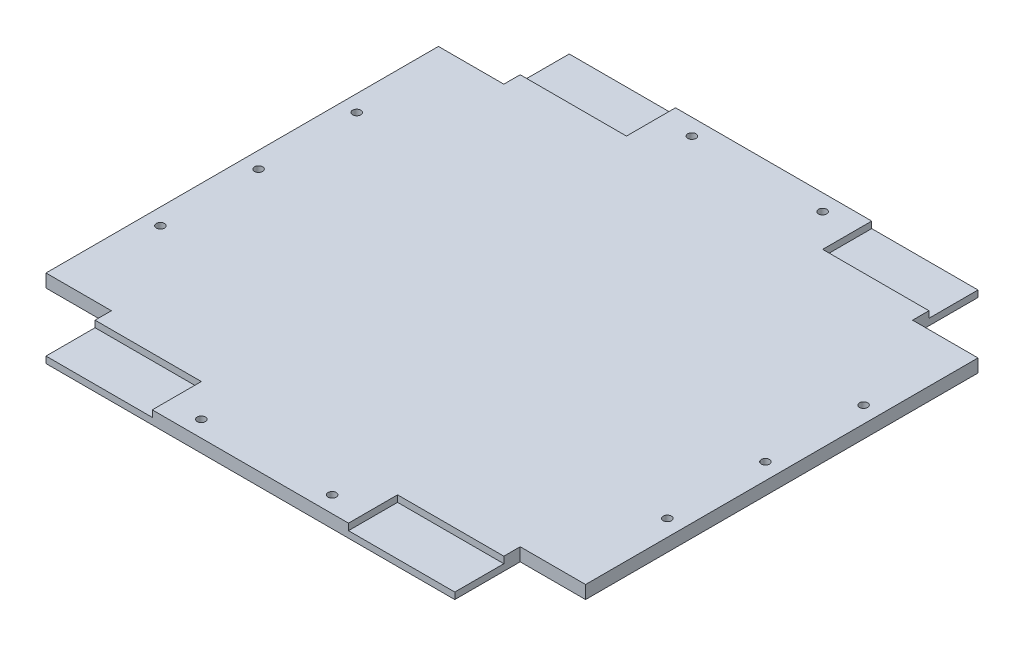
ISO-10303-21;
HEADER;
FILE_DESCRIPTION(('STEP AP214'),'2;1');
FILE_NAME('part.step','',(''),(''),'','','');
FILE_SCHEMA(('AUTOMOTIVE_DESIGN { 1 0 10303 214 1 1 1 1 }'));
ENDSEC;
DATA;
#1=APPLICATION_CONTEXT('core data for automotive mechanical design processes');
#2=APPLICATION_PROTOCOL_DEFINITION('international standard','automotive_design',2000,#1);
#3=PRODUCT_CONTEXT('',#1,'mechanical');
#4=PRODUCT('Part','Part','',(#3));
#5=PRODUCT_RELATED_PRODUCT_CATEGORY('part','',(#4));
#6=PRODUCT_DEFINITION_FORMATION('','',#4);
#7=PRODUCT_DEFINITION_CONTEXT('part definition',#1,'design');
#8=PRODUCT_DEFINITION('design','',#6,#7);
#9=PRODUCT_DEFINITION_SHAPE('','',#8);
#10=(LENGTH_UNIT() NAMED_UNIT(*) SI_UNIT(.MILLI.,.METRE.));
#11=(NAMED_UNIT(*) PLANE_ANGLE_UNIT() SI_UNIT($,.RADIAN.));
#12=(NAMED_UNIT(*) SI_UNIT($,.STERADIAN.) SOLID_ANGLE_UNIT());
#13=UNCERTAINTY_MEASURE_WITH_UNIT(LENGTH_MEASURE(1.E-05),#10,'distance_accuracy_value','');
#14=(GEOMETRIC_REPRESENTATION_CONTEXT(3) GLOBAL_UNCERTAINTY_ASSIGNED_CONTEXT((#13)) GLOBAL_UNIT_ASSIGNED_CONTEXT((#10,
#11,#12)) REPRESENTATION_CONTEXT('',''));
#15=CARTESIAN_POINT('',(0.,0.,0.));
#16=DIRECTION('',(0.,0.,1.));
#17=DIRECTION('',(1.,0.,0.));
#18=AXIS2_PLACEMENT_3D('',#15,#16,#17);
#19=CARTESIAN_POINT('',(0.,8.,0.));
#20=DIRECTION('',(0.,-1.,0.));
#21=DIRECTION('',(0.,0.,-1.));
#22=AXIS2_PLACEMENT_3D('',#19,#20,#21);
#23=PLANE('',#22);
#24=CARTESIAN_POINT('',(-40.,8.,-150.));
#25=DIRECTION('',(0.,1.,0.));
#26=DIRECTION('',(0.,0.,-1.));
#27=AXIS2_PLACEMENT_3D('',#24,#25,#26);
#28=CIRCLE('',#27,2.5);
#29=CARTESIAN_POINT('',(-40.,8.,-152.5));
#30=VERTEX_POINT('',#29);
#31=EDGE_CURVE('E298',#30,#30,#28,.T.);
#32=ORIENTED_EDGE('',*,*,#31,.F.);
#33=EDGE_LOOP('',(#32));
#34=FACE_BOUND('',#33,.T.);
#35=CARTESIAN_POINT('',(-40.,8.,150.));
#36=DIRECTION('',(0.,1.,0.));
#37=DIRECTION('',(0.,0.,1.));
#38=AXIS2_PLACEMENT_3D('',#35,#36,#37);
#39=CIRCLE('',#38,2.5);
#40=CARTESIAN_POINT('',(-40.,8.,152.5));
#41=VERTEX_POINT('',#40);
#42=EDGE_CURVE('E313',#41,#41,#39,.T.);
#43=ORIENTED_EDGE('',*,*,#42,.F.);
#44=EDGE_LOOP('',(#43));
#45=FACE_BOUND('',#44,.T.);
#46=CARTESIAN_POINT('',(-155.,8.,-60.0000000000001));
#47=DIRECTION('',(0.,1.,0.));
#48=DIRECTION('',(0.,0.,-1.));
#49=AXIS2_PLACEMENT_3D('',#46,#47,#48);
#50=CIRCLE('',#49,2.5);
#51=CARTESIAN_POINT('',(-155.,8.,-62.5000000000001));
#52=VERTEX_POINT('',#51);
#53=EDGE_CURVE('E307',#52,#52,#50,.T.);
#54=ORIENTED_EDGE('',*,*,#53,.F.);
#55=EDGE_LOOP('',(#54));
#56=FACE_BOUND('',#55,.T.);
#57=CARTESIAN_POINT('',(-155.,8.,0.));
#58=DIRECTION('',(0.,1.,0.));
#59=DIRECTION('',(0.,0.,-1.));
#60=AXIS2_PLACEMENT_3D('',#57,#58,#59);
#61=CIRCLE('',#60,2.5);
#62=CARTESIAN_POINT('',(-155.,8.,-2.50000000000006));
#63=VERTEX_POINT('',#62);
#64=EDGE_CURVE('E299',#63,#63,#61,.T.);
#65=ORIENTED_EDGE('',*,*,#64,.F.);
#66=EDGE_LOOP('',(#65));
#67=FACE_BOUND('',#66,.T.);
#68=CARTESIAN_POINT('',(-155.,8.,59.9999999999999));
#69=DIRECTION('',(0.,1.,0.));
#70=DIRECTION('',(0.,0.,-1.));
#71=AXIS2_PLACEMENT_3D('',#68,#69,#70);
#72=CIRCLE('',#71,2.5);
#73=CARTESIAN_POINT('',(-155.,8.,57.4999999999999));
#74=VERTEX_POINT('',#73);
#75=EDGE_CURVE('E306',#74,#74,#72,.T.);
#76=ORIENTED_EDGE('',*,*,#75,.F.);
#77=EDGE_LOOP('',(#76));
#78=FACE_BOUND('',#77,.T.);
#79=CARTESIAN_POINT('',(40.,8.,150.));
#80=DIRECTION('',(0.,1.,0.));
#81=DIRECTION('',(0.,0.,1.));
#82=AXIS2_PLACEMENT_3D('',#79,#80,#81);
#83=CIRCLE('',#82,2.5);
#84=CARTESIAN_POINT('',(40.,8.,152.5));
#85=VERTEX_POINT('',#84);
#86=EDGE_CURVE('E337',#85,#85,#83,.T.);
#87=ORIENTED_EDGE('',*,*,#86,.F.);
#88=EDGE_LOOP('',(#87));
#89=FACE_BOUND('',#88,.T.);
#90=CARTESIAN_POINT('',(155.,8.,59.9999999999999));
#91=DIRECTION('',(0.,1.,0.));
#92=DIRECTION('',(0.,0.,1.));
#93=AXIS2_PLACEMENT_3D('',#90,#91,#92);
#94=CIRCLE('',#93,2.5);
#95=CARTESIAN_POINT('',(155.,8.,62.4999999999999));
#96=VERTEX_POINT('',#95);
#97=EDGE_CURVE('E331',#96,#96,#94,.T.);
#98=ORIENTED_EDGE('',*,*,#97,.F.);
#99=EDGE_LOOP('',(#98));
#100=FACE_BOUND('',#99,.T.);
#101=CARTESIAN_POINT('',(155.,8.,0.));
#102=DIRECTION('',(0.,1.,0.));
#103=DIRECTION('',(0.,0.,1.));
#104=AXIS2_PLACEMENT_3D('',#101,#102,#103);
#105=CIRCLE('',#104,2.5);
#106=CARTESIAN_POINT('',(155.,8.,2.49999999999993));
#107=VERTEX_POINT('',#106);
#108=EDGE_CURVE('E323',#107,#107,#105,.T.);
#109=ORIENTED_EDGE('',*,*,#108,.F.);
#110=EDGE_LOOP('',(#109));
#111=FACE_BOUND('',#110,.T.);
#112=CARTESIAN_POINT('',(40.,8.,-150.));
#113=DIRECTION('',(0.,1.,0.));
#114=DIRECTION('',(0.,0.,-1.));
#115=AXIS2_PLACEMENT_3D('',#112,#113,#114);
#116=CIRCLE('',#115,2.5);
#117=CARTESIAN_POINT('',(40.,8.,-152.5));
#118=VERTEX_POINT('',#117);
#119=EDGE_CURVE('E288',#118,#118,#116,.T.);
#120=ORIENTED_EDGE('',*,*,#119,.F.);
#121=EDGE_LOOP('',(#120));
#122=FACE_BOUND('',#121,.T.);
#123=CARTESIAN_POINT('',(155.,8.,-60.0000000000001));
#124=DIRECTION('',(0.,1.,0.));
#125=DIRECTION('',(0.,0.,1.));
#126=AXIS2_PLACEMENT_3D('',#123,#124,#125);
#127=CIRCLE('',#126,2.5);
#128=CARTESIAN_POINT('',(155.,8.,-57.5000000000001));
#129=VERTEX_POINT('',#128);
#130=EDGE_CURVE('E330',#129,#129,#127,.T.);
#131=ORIENTED_EDGE('',*,*,#130,.F.);
#132=EDGE_LOOP('',(#131));
#133=FACE_BOUND('',#132,.T.);
#134=DIRECTION('',(0.,0.,-1.));
#135=VECTOR('',#134,1.);
#136=CARTESIAN_POINT('',(59.9999999999999,8.,-160.));
#137=LINE('',#136,#135);
#138=CARTESIAN_POINT('',(59.9999999999999,8.,-130.));
#139=VERTEX_POINT('',#138);
#140=CARTESIAN_POINT('',(59.9999999999999,8.,-160.));
#141=VERTEX_POINT('',#140);
#142=EDGE_CURVE('E209',#139,#141,#137,.T.);
#143=ORIENTED_EDGE('',*,*,#142,.T.);
#144=DIRECTION('',(-1.,0.,0.));
#145=VECTOR('',#144,1.);
#146=CARTESIAN_POINT('',(125.,8.,-160.));
#147=LINE('',#146,#145);
#148=CARTESIAN_POINT('',(-60.,8.,-160.));
#149=VERTEX_POINT('',#148);
#150=EDGE_CURVE('E379',#141,#149,#147,.T.);
#151=ORIENTED_EDGE('',*,*,#150,.T.);
#152=DIRECTION('',(0.,0.,-1.));
#153=VECTOR('',#152,1.);
#154=CARTESIAN_POINT('',(-60.,8.,-160.));
#155=LINE('',#154,#153);
#156=CARTESIAN_POINT('',(-60.,8.,-130.));
#157=VERTEX_POINT('',#156);
#158=EDGE_CURVE('E264',#157,#149,#155,.T.);
#159=ORIENTED_EDGE('',*,*,#158,.F.);
#160=DIRECTION('',(1.,0.,0.));
#161=VECTOR('',#160,1.);
#162=CARTESIAN_POINT('',(-60.,8.,-130.));
#163=LINE('',#162,#161);
#164=CARTESIAN_POINT('',(-125.,8.,-130.));
#165=VERTEX_POINT('',#164);
#166=EDGE_CURVE('E274',#165,#157,#163,.T.);
#167=ORIENTED_EDGE('',*,*,#166,.F.);
#168=DIRECTION('',(0.,0.,1.));
#169=VECTOR('',#168,1.);
#170=CARTESIAN_POINT('',(-125.,8.,-160.));
#171=LINE('',#170,#169);
#172=CARTESIAN_POINT('',(-125.,8.,-120.));
#173=VERTEX_POINT('',#172);
#174=EDGE_CURVE('E353',#165,#173,#171,.T.);
#175=ORIENTED_EDGE('',*,*,#174,.T.);
#176=DIRECTION('',(-1.,0.,0.));
#177=VECTOR('',#176,1.);
#178=CARTESIAN_POINT('',(-125.,8.,-120.));
#179=LINE('',#178,#177);
#180=CARTESIAN_POINT('',(-165.,8.,-120.));
#181=VERTEX_POINT('',#180);
#182=EDGE_CURVE('E355',#173,#181,#179,.T.);
#183=ORIENTED_EDGE('',*,*,#182,.T.);
#184=DIRECTION('',(0.,0.,1.));
#185=VECTOR('',#184,1.);
#186=CARTESIAN_POINT('',(-165.,8.,-120.));
#187=LINE('',#186,#185);
#188=CARTESIAN_POINT('',(-165.,8.,120.));
#189=VERTEX_POINT('',#188);
#190=EDGE_CURVE('E358',#181,#189,#187,.T.);
#191=ORIENTED_EDGE('',*,*,#190,.T.);
#192=DIRECTION('',(1.,0.,0.));
#193=VECTOR('',#192,1.);
#194=CARTESIAN_POINT('',(-125.,8.,120.));
#195=LINE('',#194,#193);
#196=CARTESIAN_POINT('',(-125.,8.,120.));
#197=VERTEX_POINT('',#196);
#198=EDGE_CURVE('E360',#189,#197,#195,.T.);
#199=ORIENTED_EDGE('',*,*,#198,.T.);
#200=DIRECTION('',(0.,0.,1.));
#201=VECTOR('',#200,1.);
#202=CARTESIAN_POINT('',(-125.,8.,160.));
#203=LINE('',#202,#201);
#204=CARTESIAN_POINT('',(-125.,8.,130.));
#205=VERTEX_POINT('',#204);
#206=EDGE_CURVE('E362',#197,#205,#203,.T.);
#207=ORIENTED_EDGE('',*,*,#206,.T.);
#208=DIRECTION('',(1.,0.,0.));
#209=VECTOR('',#208,1.);
#210=CARTESIAN_POINT('',(-60.,8.,130.));
#211=LINE('',#210,#209);
#212=CARTESIAN_POINT('',(-60.,8.,130.));
#213=VERTEX_POINT('',#212);
#214=EDGE_CURVE('E249',#205,#213,#211,.T.);
#215=ORIENTED_EDGE('',*,*,#214,.T.);
#216=DIRECTION('',(0.,0.,1.));
#217=VECTOR('',#216,1.);
#218=CARTESIAN_POINT('',(-60.,8.,160.));
#219=LINE('',#218,#217);
#220=CARTESIAN_POINT('',(-60.,8.,160.));
#221=VERTEX_POINT('',#220);
#222=EDGE_CURVE('E240',#213,#221,#219,.T.);
#223=ORIENTED_EDGE('',*,*,#222,.T.);
#224=DIRECTION('',(1.,0.,0.));
#225=VECTOR('',#224,1.);
#226=CARTESIAN_POINT('',(125.,8.,160.));
#227=LINE('',#226,#225);
#228=CARTESIAN_POINT('',(60.0000000000001,8.,160.));
#229=VERTEX_POINT('',#228);
#230=EDGE_CURVE('E365',#221,#229,#227,.T.);
#231=ORIENTED_EDGE('',*,*,#230,.T.);
#232=DIRECTION('',(0.,0.,1.));
#233=VECTOR('',#232,1.);
#234=CARTESIAN_POINT('',(60.0000000000001,8.,160.));
#235=LINE('',#234,#233);
#236=CARTESIAN_POINT('',(60.,8.,130.));
#237=VERTEX_POINT('',#236);
#238=EDGE_CURVE('E223',#237,#229,#235,.T.);
#239=ORIENTED_EDGE('',*,*,#238,.F.);
#240=DIRECTION('',(-1.,0.,0.));
#241=VECTOR('',#240,1.);
#242=CARTESIAN_POINT('',(60.,8.,130.));
#243=LINE('',#242,#241);
#244=CARTESIAN_POINT('',(125.,8.,130.));
#245=VERTEX_POINT('',#244);
#246=EDGE_CURVE('E227',#245,#237,#243,.T.);
#247=ORIENTED_EDGE('',*,*,#246,.F.);
#248=DIRECTION('',(0.,0.,-1.));
#249=VECTOR('',#248,1.);
#250=CARTESIAN_POINT('',(125.,8.,160.));
#251=LINE('',#250,#249);
#252=CARTESIAN_POINT('',(125.,8.,120.));
#253=VERTEX_POINT('',#252);
#254=EDGE_CURVE('E368',#245,#253,#251,.T.);
#255=ORIENTED_EDGE('',*,*,#254,.T.);
#256=DIRECTION('',(1.,0.,0.));
#257=VECTOR('',#256,1.);
#258=CARTESIAN_POINT('',(125.,8.,120.));
#259=LINE('',#258,#257);
#260=CARTESIAN_POINT('',(165.,8.,120.));
#261=VERTEX_POINT('',#260);
#262=EDGE_CURVE('E370',#253,#261,#259,.T.);
#263=ORIENTED_EDGE('',*,*,#262,.T.);
#264=DIRECTION('',(0.,0.,-1.));
#265=VECTOR('',#264,1.);
#266=CARTESIAN_POINT('',(165.,8.,-120.));
#267=LINE('',#266,#265);
#268=CARTESIAN_POINT('',(165.,8.,-120.));
#269=VERTEX_POINT('',#268);
#270=EDGE_CURVE('E372',#261,#269,#267,.T.);
#271=ORIENTED_EDGE('',*,*,#270,.T.);
#272=DIRECTION('',(-1.,0.,0.));
#273=VECTOR('',#272,1.);
#274=CARTESIAN_POINT('',(125.,8.,-120.));
#275=LINE('',#274,#273);
#276=CARTESIAN_POINT('',(125.,8.,-120.));
#277=VERTEX_POINT('',#276);
#278=EDGE_CURVE('E374',#269,#277,#275,.T.);
#279=ORIENTED_EDGE('',*,*,#278,.T.);
#280=DIRECTION('',(0.,0.,-1.));
#281=VECTOR('',#280,1.);
#282=CARTESIAN_POINT('',(125.,8.,-160.));
#283=LINE('',#282,#281);
#284=CARTESIAN_POINT('',(125.,8.,-130.));
#285=VERTEX_POINT('',#284);
#286=EDGE_CURVE('E376',#277,#285,#283,.T.);
#287=ORIENTED_EDGE('',*,*,#286,.T.);
#288=DIRECTION('',(-1.,0.,0.));
#289=VECTOR('',#288,1.);
#290=CARTESIAN_POINT('',(59.9999999999999,8.,-130.));
#291=LINE('',#290,#289);
#292=EDGE_CURVE('E214',#285,#139,#291,.T.);
#293=ORIENTED_EDGE('',*,*,#292,.T.);
#294=EDGE_LOOP('',(#143,#151,#159,#167,#175,#183,#191,#199,#207,#215,#223,#231,#239,#247,#255,
#263,#271,#279,#287,#293));
#295=FACE_BOUND('',#294,.T.);
#296=ADVANCED_FACE('F33',(#34,#45,#56,#67,#78,#89,#100,#111,#122,#133,#295),#23,.F.);
#297=CARTESIAN_POINT('',(125.,8.,-160.));
#298=DIRECTION('',(-1.,0.,0.));
#299=DIRECTION('',(0.,0.,1.));
#300=AXIS2_PLACEMENT_3D('',#297,#298,#299);
#301=PLANE('',#300);
#302=DIRECTION('',(0.,1.,0.));
#303=VECTOR('',#302,1.);
#304=CARTESIAN_POINT('',(125.,4.,-130.));
#305=LINE('',#304,#303);
#306=CARTESIAN_POINT('',(125.,4.,-130.));
#307=VERTEX_POINT('',#306);
#308=EDGE_CURVE('E200',#307,#285,#305,.T.);
#309=ORIENTED_EDGE('',*,*,#308,.T.);
#310=ORIENTED_EDGE('',*,*,#286,.F.);
#311=DIRECTION('',(0.,-1.,0.));
#312=VECTOR('',#311,1.);
#313=CARTESIAN_POINT('',(125.,8.,-120.));
#314=LINE('',#313,#312);
#315=CARTESIAN_POINT('',(125.,0.,-120.));
#316=VERTEX_POINT('',#315);
#317=EDGE_CURVE('E412',#277,#316,#314,.T.);
#318=ORIENTED_EDGE('',*,*,#317,.T.);
#319=DIRECTION('',(0.,0.,-1.));
#320=VECTOR('',#319,1.);
#321=CARTESIAN_POINT('',(125.,0.,-160.));
#322=LINE('',#321,#320);
#323=CARTESIAN_POINT('',(125.,0.,-160.));
#324=VERTEX_POINT('',#323);
#325=EDGE_CURVE('E404',#316,#324,#322,.T.);
#326=ORIENTED_EDGE('',*,*,#325,.T.);
#327=DIRECTION('',(0.,-1.,0.));
#328=VECTOR('',#327,1.);
#329=CARTESIAN_POINT('',(125.,8.,-160.));
#330=LINE('',#329,#328);
#331=CARTESIAN_POINT('',(125.,4.,-160.));
#332=VERTEX_POINT('',#331);
#333=EDGE_CURVE('E410',#332,#324,#330,.T.);
#334=ORIENTED_EDGE('',*,*,#333,.F.);
#335=DIRECTION('',(0.,0.,1.));
#336=VECTOR('',#335,1.);
#337=CARTESIAN_POINT('',(125.,4.,-160.));
#338=LINE('',#337,#336);
#339=EDGE_CURVE('E48',#332,#307,#338,.T.);
#340=ORIENTED_EDGE('',*,*,#339,.T.);
#341=EDGE_LOOP('',(#309,#310,#318,#326,#334,#340));
#342=FACE_BOUND('',#341,.T.);
#343=ADVANCED_FACE('F473',(#342),#301,.F.);
#344=CARTESIAN_POINT('',(125.,8.,-160.));
#345=DIRECTION('',(0.,0.,1.));
#346=DIRECTION('',(1.,0.,0.));
#347=AXIS2_PLACEMENT_3D('',#344,#345,#346);
#348=PLANE('',#347);
#349=DIRECTION('',(0.,1.,0.));
#350=VECTOR('',#349,1.);
#351=CARTESIAN_POINT('',(59.9999999999999,4.,-160.));
#352=LINE('',#351,#350);
#353=CARTESIAN_POINT('',(59.9999999999999,4.,-160.));
#354=VERTEX_POINT('',#353);
#355=EDGE_CURVE('E221',#354,#141,#352,.T.);
#356=ORIENTED_EDGE('',*,*,#355,.F.);
#357=DIRECTION('',(1.,0.,0.));
#358=VECTOR('',#357,1.);
#359=CARTESIAN_POINT('',(59.9999999999999,4.,-160.));
#360=LINE('',#359,#358);
#361=EDGE_CURVE('E211',#354,#332,#360,.T.);
#362=ORIENTED_EDGE('',*,*,#361,.T.);
#363=ORIENTED_EDGE('',*,*,#333,.T.);
#364=DIRECTION('',(-1.,0.,0.));
#365=VECTOR('',#364,1.);
#366=CARTESIAN_POINT('',(125.,0.,-160.));
#367=LINE('',#366,#365);
#368=CARTESIAN_POINT('',(-125.,0.,-160.));
#369=VERTEX_POINT('',#368);
#370=EDGE_CURVE('E356',#324,#369,#367,.T.);
#371=ORIENTED_EDGE('',*,*,#370,.T.);
#372=DIRECTION('',(0.,-1.,0.));
#373=VECTOR('',#372,1.);
#374=CARTESIAN_POINT('',(-125.,8.,-160.));
#375=LINE('',#374,#373);
#376=CARTESIAN_POINT('',(-125.,4.,-160.));
#377=VERTEX_POINT('',#376);
#378=EDGE_CURVE('E381',#377,#369,#375,.T.);
#379=ORIENTED_EDGE('',*,*,#378,.F.);
#380=DIRECTION('',(-1.,0.,0.));
#381=VECTOR('',#380,1.);
#382=CARTESIAN_POINT('',(-60.,4.,-160.));
#383=LINE('',#382,#381);
#384=CARTESIAN_POINT('',(-60.,4.,-160.));
#385=VERTEX_POINT('',#384);
#386=EDGE_CURVE('E273',#385,#377,#383,.T.);
#387=ORIENTED_EDGE('',*,*,#386,.F.);
#388=DIRECTION('',(0.,1.,0.));
#389=VECTOR('',#388,1.);
#390=CARTESIAN_POINT('',(-60.,4.,-160.));
#391=LINE('',#390,#389);
#392=EDGE_CURVE('E281',#385,#149,#391,.T.);
#393=ORIENTED_EDGE('',*,*,#392,.T.);
#394=ORIENTED_EDGE('',*,*,#150,.F.);
#395=EDGE_LOOP('',(#356,#362,#363,#371,#379,#387,#393,#394));
#396=FACE_BOUND('',#395,.T.);
#397=ADVANCED_FACE('F469',(#396),#348,.F.);
#398=CARTESIAN_POINT('',(-125.,8.,160.));
#399=DIRECTION('',(1.,0.,0.));
#400=DIRECTION('',(0.,0.,-1.));
#401=AXIS2_PLACEMENT_3D('',#398,#399,#400);
#402=PLANE('',#401);
#403=DIRECTION('',(0.,1.,0.));
#404=VECTOR('',#403,1.);
#405=CARTESIAN_POINT('',(-125.,4.,130.));
#406=LINE('',#405,#404);
#407=CARTESIAN_POINT('',(-125.,4.,130.));
#408=VERTEX_POINT('',#407);
#409=EDGE_CURVE('E265',#408,#205,#406,.T.);
#410=ORIENTED_EDGE('',*,*,#409,.T.);
#411=ORIENTED_EDGE('',*,*,#206,.F.);
#412=DIRECTION('',(0.,-1.,0.));
#413=VECTOR('',#412,1.);
#414=CARTESIAN_POINT('',(-125.,8.,120.));
#415=LINE('',#414,#413);
#416=CARTESIAN_POINT('',(-125.,0.,120.));
#417=VERTEX_POINT('',#416);
#418=EDGE_CURVE('E428',#197,#417,#415,.T.);
#419=ORIENTED_EDGE('',*,*,#418,.T.);
#420=DIRECTION('',(0.,0.,1.));
#421=VECTOR('',#420,1.);
#422=CARTESIAN_POINT('',(-125.,0.,160.));
#423=LINE('',#422,#421);
#424=CARTESIAN_POINT('',(-125.,0.,160.));
#425=VERTEX_POINT('',#424);
#426=EDGE_CURVE('E390',#417,#425,#423,.T.);
#427=ORIENTED_EDGE('',*,*,#426,.T.);
#428=DIRECTION('',(0.,-1.,0.));
#429=VECTOR('',#428,1.);
#430=CARTESIAN_POINT('',(-125.,8.,160.));
#431=LINE('',#430,#429);
#432=CARTESIAN_POINT('',(-125.,4.,160.));
#433=VERTEX_POINT('',#432);
#434=EDGE_CURVE('E426',#433,#425,#431,.T.);
#435=ORIENTED_EDGE('',*,*,#434,.F.);
#436=DIRECTION('',(0.,0.,-1.));
#437=VECTOR('',#436,1.);
#438=CARTESIAN_POINT('',(-125.,4.,160.));
#439=LINE('',#438,#437);
#440=EDGE_CURVE('E251',#433,#408,#439,.T.);
#441=ORIENTED_EDGE('',*,*,#440,.T.);
#442=EDGE_LOOP('',(#410,#411,#419,#427,#435,#441));
#443=FACE_BOUND('',#442,.T.);
#444=ADVANCED_FACE('F454',(#443),#402,.F.);
#445=CARTESIAN_POINT('',(125.,8.,160.));
#446=DIRECTION('',(0.,0.,-1.));
#447=DIRECTION('',(-1.,0.,0.));
#448=AXIS2_PLACEMENT_3D('',#445,#446,#447);
#449=PLANE('',#448);
#450=DIRECTION('',(1.,0.,0.));
#451=VECTOR('',#450,1.);
#452=CARTESIAN_POINT('',(60.0000000000001,4.,160.));
#453=LINE('',#452,#451);
#454=CARTESIAN_POINT('',(60.0000000000001,4.,160.));
#455=VERTEX_POINT('',#454);
#456=CARTESIAN_POINT('',(125.,4.,160.));
#457=VERTEX_POINT('',#456);
#458=EDGE_CURVE('E56',#455,#457,#453,.T.);
#459=ORIENTED_EDGE('',*,*,#458,.F.);
#460=DIRECTION('',(0.,1.,0.));
#461=VECTOR('',#460,1.);
#462=CARTESIAN_POINT('',(60.0000000000001,4.,160.));
#463=LINE('',#462,#461);
#464=EDGE_CURVE('E234',#455,#229,#463,.T.);
#465=ORIENTED_EDGE('',*,*,#464,.T.);
#466=ORIENTED_EDGE('',*,*,#230,.F.);
#467=DIRECTION('',(0.,1.,0.));
#468=VECTOR('',#467,1.);
#469=CARTESIAN_POINT('',(-60.,4.,160.));
#470=LINE('',#469,#468);
#471=CARTESIAN_POINT('',(-60.,4.,160.));
#472=VERTEX_POINT('',#471);
#473=EDGE_CURVE('E262',#472,#221,#470,.T.);
#474=ORIENTED_EDGE('',*,*,#473,.F.);
#475=DIRECTION('',(-1.,0.,0.));
#476=VECTOR('',#475,1.);
#477=CARTESIAN_POINT('',(-60.,4.,160.));
#478=LINE('',#477,#476);
#479=EDGE_CURVE('E254',#472,#433,#478,.T.);
#480=ORIENTED_EDGE('',*,*,#479,.T.);
#481=ORIENTED_EDGE('',*,*,#434,.T.);
#482=DIRECTION('',(1.,0.,0.));
#483=VECTOR('',#482,1.);
#484=CARTESIAN_POINT('',(125.,0.,160.));
#485=LINE('',#484,#483);
#486=CARTESIAN_POINT('',(125.,0.,160.));
#487=VERTEX_POINT('',#486);
#488=EDGE_CURVE('E393',#425,#487,#485,.T.);
#489=ORIENTED_EDGE('',*,*,#488,.T.);
#490=DIRECTION('',(0.,-1.,0.));
#491=VECTOR('',#490,1.);
#492=CARTESIAN_POINT('',(125.,8.,160.));
#493=LINE('',#492,#491);
#494=EDGE_CURVE('E424',#457,#487,#493,.T.);
#495=ORIENTED_EDGE('',*,*,#494,.F.);
#496=EDGE_LOOP('',(#459,#465,#466,#474,#480,#481,#489,#495));
#497=FACE_BOUND('',#496,.T.);
#498=ADVANCED_FACE('F497',(#497),#449,.F.);
#499=CARTESIAN_POINT('',(-125.,8.,-160.));
#500=DIRECTION('',(1.,0.,0.));
#501=DIRECTION('',(0.,0.,-1.));
#502=AXIS2_PLACEMENT_3D('',#499,#500,#501);
#503=PLANE('',#502);
#504=ORIENTED_EDGE('',*,*,#174,.F.);
#505=DIRECTION('',(0.,1.,0.));
#506=VECTOR('',#505,1.);
#507=CARTESIAN_POINT('',(-125.,4.,-130.));
#508=LINE('',#507,#506);
#509=CARTESIAN_POINT('',(-125.,4.,-130.));
#510=VERTEX_POINT('',#509);
#511=EDGE_CURVE('E289',#510,#165,#508,.T.);
#512=ORIENTED_EDGE('',*,*,#511,.F.);
#513=DIRECTION('',(0.,0.,1.));
#514=VECTOR('',#513,1.);
#515=CARTESIAN_POINT('',(-125.,4.,-160.));
#516=LINE('',#515,#514);
#517=EDGE_CURVE('E276',#377,#510,#516,.T.);
#518=ORIENTED_EDGE('',*,*,#517,.F.);
#519=ORIENTED_EDGE('',*,*,#378,.T.);
#520=DIRECTION('',(0.,0.,1.));
#521=VECTOR('',#520,1.);
#522=CARTESIAN_POINT('',(-125.,0.,-160.));
#523=LINE('',#522,#521);
#524=CARTESIAN_POINT('',(-125.,0.,-120.));
#525=VERTEX_POINT('',#524);
#526=EDGE_CURVE('E352',#369,#525,#523,.T.);
#527=ORIENTED_EDGE('',*,*,#526,.T.);
#528=DIRECTION('',(0.,-1.,0.));
#529=VECTOR('',#528,1.);
#530=CARTESIAN_POINT('',(-125.,8.,-120.));
#531=LINE('',#530,#529);
#532=EDGE_CURVE('E11',#173,#525,#531,.T.);
#533=ORIENTED_EDGE('',*,*,#532,.F.);
#534=EDGE_LOOP('',(#504,#512,#518,#519,#527,#533));
#535=FACE_BOUND('',#534,.T.);
#536=ADVANCED_FACE('F35',(#535),#503,.F.);
#537=CARTESIAN_POINT('',(-125.,8.,-120.));
#538=DIRECTION('',(0.,0.,1.));
#539=DIRECTION('',(1.,0.,0.));
#540=AXIS2_PLACEMENT_3D('',#537,#538,#539);
#541=PLANE('',#540);
#542=DIRECTION('',(-1.,0.,0.));
#543=VECTOR('',#542,1.);
#544=CARTESIAN_POINT('',(-125.,0.,-120.));
#545=LINE('',#544,#543);
#546=CARTESIAN_POINT('',(-165.,0.,-120.));
#547=VERTEX_POINT('',#546);
#548=EDGE_CURVE('E384',#525,#547,#545,.T.);
#549=ORIENTED_EDGE('',*,*,#548,.T.);
#550=DIRECTION('',(0.,-1.,0.));
#551=VECTOR('',#550,1.);
#552=CARTESIAN_POINT('',(-165.,8.,-120.));
#553=LINE('',#552,#551);
#554=EDGE_CURVE('E41',#181,#547,#553,.T.);
#555=ORIENTED_EDGE('',*,*,#554,.F.);
#556=ORIENTED_EDGE('',*,*,#182,.F.);
#557=ORIENTED_EDGE('',*,*,#532,.T.);
#558=EDGE_LOOP('',(#549,#555,#556,#557));
#559=FACE_BOUND('',#558,.T.);
#560=ADVANCED_FACE('F460',(#559),#541,.F.);
#561=CARTESIAN_POINT('',(-165.,8.,-120.));
#562=DIRECTION('',(1.,0.,0.));
#563=DIRECTION('',(0.,0.,-1.));
#564=AXIS2_PLACEMENT_3D('',#561,#562,#563);
#565=PLANE('',#564);
#566=DIRECTION('',(0.,0.,1.));
#567=VECTOR('',#566,1.);
#568=CARTESIAN_POINT('',(-165.,0.,-120.));
#569=LINE('',#568,#567);
#570=CARTESIAN_POINT('',(-165.,0.,120.));
#571=VERTEX_POINT('',#570);
#572=EDGE_CURVE('E386',#547,#571,#569,.T.);
#573=ORIENTED_EDGE('',*,*,#572,.T.);
#574=DIRECTION('',(0.,-1.,0.));
#575=VECTOR('',#574,1.);
#576=CARTESIAN_POINT('',(-165.,8.,120.));
#577=LINE('',#576,#575);
#578=EDGE_CURVE('E431',#189,#571,#577,.T.);
#579=ORIENTED_EDGE('',*,*,#578,.F.);
#580=ORIENTED_EDGE('',*,*,#190,.F.);
#581=ORIENTED_EDGE('',*,*,#554,.T.);
#582=EDGE_LOOP('',(#573,#579,#580,#581));
#583=FACE_BOUND('',#582,.T.);
#584=ADVANCED_FACE('F438',(#583),#565,.F.);
#585=CARTESIAN_POINT('',(-125.,8.,120.));
#586=DIRECTION('',(0.,0.,-1.));
#587=DIRECTION('',(-1.,0.,0.));
#588=AXIS2_PLACEMENT_3D('',#585,#586,#587);
#589=PLANE('',#588);
#590=DIRECTION('',(1.,0.,0.));
#591=VECTOR('',#590,1.);
#592=CARTESIAN_POINT('',(-125.,0.,120.));
#593=LINE('',#592,#591);
#594=EDGE_CURVE('E388',#571,#417,#593,.T.);
#595=ORIENTED_EDGE('',*,*,#594,.T.);
#596=ORIENTED_EDGE('',*,*,#418,.F.);
#597=ORIENTED_EDGE('',*,*,#198,.F.);
#598=ORIENTED_EDGE('',*,*,#578,.T.);
#599=EDGE_LOOP('',(#595,#596,#597,#598));
#600=FACE_BOUND('',#599,.T.);
#601=ADVANCED_FACE('F450',(#600),#589,.F.);
#602=CARTESIAN_POINT('',(125.,8.,160.));
#603=DIRECTION('',(-1.,0.,0.));
#604=DIRECTION('',(0.,0.,1.));
#605=AXIS2_PLACEMENT_3D('',#602,#603,#604);
#606=PLANE('',#605);
#607=ORIENTED_EDGE('',*,*,#254,.F.);
#608=DIRECTION('',(0.,1.,0.));
#609=VECTOR('',#608,1.);
#610=CARTESIAN_POINT('',(125.,4.,130.));
#611=LINE('',#610,#609);
#612=CARTESIAN_POINT('',(125.,4.,130.));
#613=VERTEX_POINT('',#612);
#614=EDGE_CURVE('E241',#613,#245,#611,.T.);
#615=ORIENTED_EDGE('',*,*,#614,.F.);
#616=DIRECTION('',(0.,0.,-1.));
#617=VECTOR('',#616,1.);
#618=CARTESIAN_POINT('',(125.,4.,160.));
#619=LINE('',#618,#617);
#620=EDGE_CURVE('E229',#457,#613,#619,.T.);
#621=ORIENTED_EDGE('',*,*,#620,.F.);
#622=ORIENTED_EDGE('',*,*,#494,.T.);
#623=DIRECTION('',(0.,0.,-1.));
#624=VECTOR('',#623,1.);
#625=CARTESIAN_POINT('',(125.,0.,160.));
#626=LINE('',#625,#624);
#627=CARTESIAN_POINT('',(125.,0.,120.));
#628=VERTEX_POINT('',#627);
#629=EDGE_CURVE('E396',#487,#628,#626,.T.);
#630=ORIENTED_EDGE('',*,*,#629,.T.);
#631=DIRECTION('',(0.,-1.,0.));
#632=VECTOR('',#631,1.);
#633=CARTESIAN_POINT('',(125.,8.,120.));
#634=LINE('',#633,#632);
#635=EDGE_CURVE('E421',#253,#628,#634,.T.);
#636=ORIENTED_EDGE('',*,*,#635,.F.);
#637=EDGE_LOOP('',(#607,#615,#621,#622,#630,#636));
#638=FACE_BOUND('',#637,.T.);
#639=ADVANCED_FACE('F493',(#638),#606,.F.);
#640=CARTESIAN_POINT('',(125.,8.,120.));
#641=DIRECTION('',(0.,0.,-1.));
#642=DIRECTION('',(-1.,0.,0.));
#643=AXIS2_PLACEMENT_3D('',#640,#641,#642);
#644=PLANE('',#643);
#645=DIRECTION('',(1.,0.,0.));
#646=VECTOR('',#645,1.);
#647=CARTESIAN_POINT('',(125.,0.,120.));
#648=LINE('',#647,#646);
#649=CARTESIAN_POINT('',(165.,0.,120.));
#650=VERTEX_POINT('',#649);
#651=EDGE_CURVE('E398',#628,#650,#648,.T.);
#652=ORIENTED_EDGE('',*,*,#651,.T.);
#653=DIRECTION('',(0.,-1.,0.));
#654=VECTOR('',#653,1.);
#655=CARTESIAN_POINT('',(165.,8.,120.));
#656=LINE('',#655,#654);
#657=EDGE_CURVE('E418',#261,#650,#656,.T.);
#658=ORIENTED_EDGE('',*,*,#657,.F.);
#659=ORIENTED_EDGE('',*,*,#262,.F.);
#660=ORIENTED_EDGE('',*,*,#635,.T.);
#661=EDGE_LOOP('',(#652,#658,#659,#660));
#662=FACE_BOUND('',#661,.T.);
#663=ADVANCED_FACE('F489',(#662),#644,.F.);
#664=CARTESIAN_POINT('',(165.,8.,-120.));
#665=DIRECTION('',(-1.,0.,0.));
#666=DIRECTION('',(0.,0.,1.));
#667=AXIS2_PLACEMENT_3D('',#664,#665,#666);
#668=PLANE('',#667);
#669=DIRECTION('',(0.,0.,-1.));
#670=VECTOR('',#669,1.);
#671=CARTESIAN_POINT('',(165.,0.,-120.));
#672=LINE('',#671,#670);
#673=CARTESIAN_POINT('',(165.,0.,-120.));
#674=VERTEX_POINT('',#673);
#675=EDGE_CURVE('E400',#650,#674,#672,.T.);
#676=ORIENTED_EDGE('',*,*,#675,.T.);
#677=DIRECTION('',(0.,-1.,0.));
#678=VECTOR('',#677,1.);
#679=CARTESIAN_POINT('',(165.,8.,-120.));
#680=LINE('',#679,#678);
#681=EDGE_CURVE('E415',#269,#674,#680,.T.);
#682=ORIENTED_EDGE('',*,*,#681,.F.);
#683=ORIENTED_EDGE('',*,*,#270,.F.);
#684=ORIENTED_EDGE('',*,*,#657,.T.);
#685=EDGE_LOOP('',(#676,#682,#683,#684));
#686=FACE_BOUND('',#685,.T.);
#687=ADVANCED_FACE('F484',(#686),#668,.F.);
#688=CARTESIAN_POINT('',(125.,8.,-120.));
#689=DIRECTION('',(0.,0.,1.));
#690=DIRECTION('',(1.,0.,0.));
#691=AXIS2_PLACEMENT_3D('',#688,#689,#690);
#692=PLANE('',#691);
#693=DIRECTION('',(-1.,0.,0.));
#694=VECTOR('',#693,1.);
#695=CARTESIAN_POINT('',(125.,0.,-120.));
#696=LINE('',#695,#694);
#697=EDGE_CURVE('E402',#674,#316,#696,.T.);
#698=ORIENTED_EDGE('',*,*,#697,.T.);
#699=ORIENTED_EDGE('',*,*,#317,.F.);
#700=ORIENTED_EDGE('',*,*,#278,.F.);
#701=ORIENTED_EDGE('',*,*,#681,.T.);
#702=EDGE_LOOP('',(#698,#699,#700,#701));
#703=FACE_BOUND('',#702,.T.);
#704=ADVANCED_FACE('F478',(#703),#692,.F.);
#705=CARTESIAN_POINT('',(0.,0.,0.));
#706=DIRECTION('',(0.,-1.,0.));
#707=DIRECTION('',(0.,0.,-1.));
#708=AXIS2_PLACEMENT_3D('',#705,#706,#707);
#709=PLANE('',#708);
#710=CARTESIAN_POINT('',(-40.,0.,-150.));
#711=DIRECTION('',(0.,-1.,0.));
#712=DIRECTION('',(0.,0.,-1.));
#713=AXIS2_PLACEMENT_3D('',#710,#711,#712);
#714=CIRCLE('',#713,2.5);
#715=CARTESIAN_POINT('',(-40.,0.,-152.5));
#716=VERTEX_POINT('',#715);
#717=EDGE_CURVE('E316',#716,#716,#714,.F.);
#718=ORIENTED_EDGE('',*,*,#717,.T.);
#719=EDGE_LOOP('',(#718));
#720=FACE_BOUND('',#719,.T.);
#721=CARTESIAN_POINT('',(-40.,0.,150.));
#722=DIRECTION('',(0.,-1.,0.));
#723=DIRECTION('',(0.,0.,-1.));
#724=AXIS2_PLACEMENT_3D('',#721,#722,#723);
#725=CIRCLE('',#724,2.5);
#726=CARTESIAN_POINT('',(-40.,0.,147.5));
#727=VERTEX_POINT('',#726);
#728=EDGE_CURVE('E310',#727,#727,#725,.F.);
#729=ORIENTED_EDGE('',*,*,#728,.T.);
#730=EDGE_LOOP('',(#729));
#731=FACE_BOUND('',#730,.T.);
#732=CARTESIAN_POINT('',(-155.,0.,-60.0000000000001));
#733=DIRECTION('',(0.,-1.,0.));
#734=DIRECTION('',(0.,0.,-1.));
#735=AXIS2_PLACEMENT_3D('',#732,#733,#734);
#736=CIRCLE('',#735,2.5);
#737=CARTESIAN_POINT('',(-155.,0.,-62.5000000000001));
#738=VERTEX_POINT('',#737);
#739=EDGE_CURVE('E303',#738,#738,#736,.F.);
#740=ORIENTED_EDGE('',*,*,#739,.T.);
#741=EDGE_LOOP('',(#740));
#742=FACE_BOUND('',#741,.T.);
#743=CARTESIAN_POINT('',(-155.,0.,0.));
#744=DIRECTION('',(0.,-1.,0.));
#745=DIRECTION('',(0.,0.,-1.));
#746=AXIS2_PLACEMENT_3D('',#743,#744,#745);
#747=CIRCLE('',#746,2.5);
#748=CARTESIAN_POINT('',(-155.,0.,-2.50000000000006));
#749=VERTEX_POINT('',#748);
#750=EDGE_CURVE('E302',#749,#749,#747,.F.);
#751=ORIENTED_EDGE('',*,*,#750,.T.);
#752=EDGE_LOOP('',(#751));
#753=FACE_BOUND('',#752,.T.);
#754=CARTESIAN_POINT('',(-155.,0.,59.9999999999999));
#755=DIRECTION('',(0.,-1.,0.));
#756=DIRECTION('',(0.,0.,-1.));
#757=AXIS2_PLACEMENT_3D('',#754,#755,#756);
#758=CIRCLE('',#757,2.5);
#759=CARTESIAN_POINT('',(-155.,0.,57.4999999999999));
#760=VERTEX_POINT('',#759);
#761=EDGE_CURVE('E340',#760,#760,#758,.F.);
#762=ORIENTED_EDGE('',*,*,#761,.T.);
#763=EDGE_LOOP('',(#762));
#764=FACE_BOUND('',#763,.T.);
#765=CARTESIAN_POINT('',(40.,0.,150.));
#766=DIRECTION('',(0.,-1.,0.));
#767=DIRECTION('',(0.,0.,-1.));
#768=AXIS2_PLACEMENT_3D('',#765,#766,#767);
#769=CIRCLE('',#768,2.5);
#770=CARTESIAN_POINT('',(40.,0.,147.5));
#771=VERTEX_POINT('',#770);
#772=EDGE_CURVE('E334',#771,#771,#769,.F.);
#773=ORIENTED_EDGE('',*,*,#772,.T.);
#774=EDGE_LOOP('',(#773));
#775=FACE_BOUND('',#774,.T.);
#776=CARTESIAN_POINT('',(155.,0.,59.9999999999999));
#777=DIRECTION('',(0.,-1.,0.));
#778=DIRECTION('',(0.,0.,-1.));
#779=AXIS2_PLACEMENT_3D('',#776,#777,#778);
#780=CIRCLE('',#779,2.5);
#781=CARTESIAN_POINT('',(155.,0.,57.4999999999999));
#782=VERTEX_POINT('',#781);
#783=EDGE_CURVE('E327',#782,#782,#780,.F.);
#784=ORIENTED_EDGE('',*,*,#783,.T.);
#785=EDGE_LOOP('',(#784));
#786=FACE_BOUND('',#785,.T.);
#787=CARTESIAN_POINT('',(155.,0.,0.));
#788=DIRECTION('',(0.,-1.,0.));
#789=DIRECTION('',(0.,0.,-1.));
#790=AXIS2_PLACEMENT_3D('',#787,#788,#789);
#791=CIRCLE('',#790,2.5);
#792=CARTESIAN_POINT('',(155.,0.,-2.50000000000006));
#793=VERTEX_POINT('',#792);
#794=EDGE_CURVE('E326',#793,#793,#791,.F.);
#795=ORIENTED_EDGE('',*,*,#794,.T.);
#796=EDGE_LOOP('',(#795));
#797=FACE_BOUND('',#796,.T.);
#798=CARTESIAN_POINT('',(40.,0.,-150.));
#799=DIRECTION('',(0.,-1.,0.));
#800=DIRECTION('',(0.,0.,-1.));
#801=AXIS2_PLACEMENT_3D('',#798,#799,#800);
#802=CIRCLE('',#801,2.5);
#803=CARTESIAN_POINT('',(40.,0.,-152.5));
#804=VERTEX_POINT('',#803);
#805=EDGE_CURVE('E295',#804,#804,#802,.F.);
#806=ORIENTED_EDGE('',*,*,#805,.T.);
#807=EDGE_LOOP('',(#806));
#808=FACE_BOUND('',#807,.T.);
#809=CARTESIAN_POINT('',(155.,0.,-60.0000000000001));
#810=DIRECTION('',(0.,-1.,0.));
#811=DIRECTION('',(0.,0.,-1.));
#812=AXIS2_PLACEMENT_3D('',#809,#810,#811);
#813=CIRCLE('',#812,2.5);
#814=CARTESIAN_POINT('',(155.,0.,-62.5000000000001));
#815=VERTEX_POINT('',#814);
#816=EDGE_CURVE('E349',#815,#815,#813,.F.);
#817=ORIENTED_EDGE('',*,*,#816,.T.);
#818=EDGE_LOOP('',(#817));
#819=FACE_BOUND('',#818,.T.);
#820=ORIENTED_EDGE('',*,*,#526,.F.);
#821=ORIENTED_EDGE('',*,*,#370,.F.);
#822=ORIENTED_EDGE('',*,*,#325,.F.);
#823=ORIENTED_EDGE('',*,*,#697,.F.);
#824=ORIENTED_EDGE('',*,*,#675,.F.);
#825=ORIENTED_EDGE('',*,*,#651,.F.);
#826=ORIENTED_EDGE('',*,*,#629,.F.);
#827=ORIENTED_EDGE('',*,*,#488,.F.);
#828=ORIENTED_EDGE('',*,*,#426,.F.);
#829=ORIENTED_EDGE('',*,*,#594,.F.);
#830=ORIENTED_EDGE('',*,*,#572,.F.);
#831=ORIENTED_EDGE('',*,*,#548,.F.);
#832=EDGE_LOOP('',(#820,#821,#822,#823,#824,#825,#826,#827,#828,#829,#830,#831));
#833=FACE_BOUND('',#832,.T.);
#834=ADVANCED_FACE('F445',(#720,#731,#742,#753,#764,#775,#786,#797,#808,#819,#833),#709,.T.);
#835=CARTESIAN_POINT('',(155.,-7.07106781186548,-60.0000000000001));
#836=DIRECTION('',(0.,1.,0.));
#837=DIRECTION('',(0.,0.,1.));
#838=AXIS2_PLACEMENT_3D('',#835,#836,#837);
#839=CYLINDRICAL_SURFACE('',#838,2.5);
#840=ORIENTED_EDGE('',*,*,#130,.T.);
#841=EDGE_LOOP('',(#840));
#842=FACE_BOUND('',#841,.T.);
#843=ORIENTED_EDGE('',*,*,#816,.F.);
#844=EDGE_LOOP('',(#843));
#845=FACE_BOUND('',#844,.T.);
#846=ADVANCED_FACE('F548',(#842,#845),#839,.F.);
#847=CARTESIAN_POINT('',(40.,-7.07106781186548,-150.));
#848=DIRECTION('',(0.,1.,0.));
#849=DIRECTION('',(0.,0.,1.));
#850=AXIS2_PLACEMENT_3D('',#847,#848,#849);
#851=CYLINDRICAL_SURFACE('',#850,2.5);
#852=ORIENTED_EDGE('',*,*,#119,.T.);
#853=EDGE_LOOP('',(#852));
#854=FACE_BOUND('',#853,.T.);
#855=ORIENTED_EDGE('',*,*,#805,.F.);
#856=EDGE_LOOP('',(#855));
#857=FACE_BOUND('',#856,.T.);
#858=ADVANCED_FACE('F702',(#854,#857),#851,.F.);
#859=CARTESIAN_POINT('',(155.,-7.07106781186548,0.));
#860=DIRECTION('',(0.,1.,0.));
#861=DIRECTION('',(0.,0.,1.));
#862=AXIS2_PLACEMENT_3D('',#859,#860,#861);
#863=CYLINDRICAL_SURFACE('',#862,2.5);
#864=ORIENTED_EDGE('',*,*,#108,.T.);
#865=EDGE_LOOP('',(#864));
#866=FACE_BOUND('',#865,.T.);
#867=ORIENTED_EDGE('',*,*,#794,.F.);
#868=EDGE_LOOP('',(#867));
#869=FACE_BOUND('',#868,.T.);
#870=ADVANCED_FACE('F694',(#866,#869),#863,.F.);
#871=CARTESIAN_POINT('',(155.,-7.07106781186548,59.9999999999999));
#872=DIRECTION('',(0.,1.,0.));
#873=DIRECTION('',(0.,0.,1.));
#874=AXIS2_PLACEMENT_3D('',#871,#872,#873);
#875=CYLINDRICAL_SURFACE('',#874,2.5);
#876=ORIENTED_EDGE('',*,*,#97,.T.);
#877=EDGE_LOOP('',(#876));
#878=FACE_BOUND('',#877,.T.);
#879=ORIENTED_EDGE('',*,*,#783,.F.);
#880=EDGE_LOOP('',(#879));
#881=FACE_BOUND('',#880,.T.);
#882=ADVANCED_FACE('F686',(#878,#881),#875,.F.);
#883=CARTESIAN_POINT('',(40.,-7.07106781186548,150.));
#884=DIRECTION('',(0.,1.,0.));
#885=DIRECTION('',(0.,0.,1.));
#886=AXIS2_PLACEMENT_3D('',#883,#884,#885);
#887=CYLINDRICAL_SURFACE('',#886,2.5);
#888=ORIENTED_EDGE('',*,*,#86,.T.);
#889=EDGE_LOOP('',(#888));
#890=FACE_BOUND('',#889,.T.);
#891=ORIENTED_EDGE('',*,*,#772,.F.);
#892=EDGE_LOOP('',(#891));
#893=FACE_BOUND('',#892,.T.);
#894=ADVANCED_FACE('F679',(#890,#893),#887,.F.);
#895=CARTESIAN_POINT('',(-155.,-7.07106781186548,59.9999999999999));
#896=DIRECTION('',(0.,1.,0.));
#897=DIRECTION('',(0.,0.,1.));
#898=AXIS2_PLACEMENT_3D('',#895,#896,#897);
#899=CYLINDRICAL_SURFACE('',#898,2.5);
#900=ORIENTED_EDGE('',*,*,#75,.T.);
#901=EDGE_LOOP('',(#900));
#902=FACE_BOUND('',#901,.T.);
#903=ORIENTED_EDGE('',*,*,#761,.F.);
#904=EDGE_LOOP('',(#903));
#905=FACE_BOUND('',#904,.T.);
#906=ADVANCED_FACE('F671',(#902,#905),#899,.F.);
#907=CARTESIAN_POINT('',(-155.,-7.07106781186548,0.));
#908=DIRECTION('',(0.,1.,0.));
#909=DIRECTION('',(0.,0.,1.));
#910=AXIS2_PLACEMENT_3D('',#907,#908,#909);
#911=CYLINDRICAL_SURFACE('',#910,2.5);
#912=ORIENTED_EDGE('',*,*,#64,.T.);
#913=EDGE_LOOP('',(#912));
#914=FACE_BOUND('',#913,.T.);
#915=ORIENTED_EDGE('',*,*,#750,.F.);
#916=EDGE_LOOP('',(#915));
#917=FACE_BOUND('',#916,.T.);
#918=ADVANCED_FACE('F663',(#914,#917),#911,.F.);
#919=CARTESIAN_POINT('',(-155.,-7.07106781186548,-60.0000000000001));
#920=DIRECTION('',(0.,1.,0.));
#921=DIRECTION('',(0.,0.,1.));
#922=AXIS2_PLACEMENT_3D('',#919,#920,#921);
#923=CYLINDRICAL_SURFACE('',#922,2.5);
#924=ORIENTED_EDGE('',*,*,#53,.T.);
#925=EDGE_LOOP('',(#924));
#926=FACE_BOUND('',#925,.T.);
#927=ORIENTED_EDGE('',*,*,#739,.F.);
#928=EDGE_LOOP('',(#927));
#929=FACE_BOUND('',#928,.T.);
#930=ADVANCED_FACE('F655',(#926,#929),#923,.F.);
#931=CARTESIAN_POINT('',(-40.,-7.07106781186548,150.));
#932=DIRECTION('',(0.,1.,0.));
#933=DIRECTION('',(0.,0.,1.));
#934=AXIS2_PLACEMENT_3D('',#931,#932,#933);
#935=CYLINDRICAL_SURFACE('',#934,2.5);
#936=ORIENTED_EDGE('',*,*,#42,.T.);
#937=EDGE_LOOP('',(#936));
#938=FACE_BOUND('',#937,.T.);
#939=ORIENTED_EDGE('',*,*,#728,.F.);
#940=EDGE_LOOP('',(#939));
#941=FACE_BOUND('',#940,.T.);
#942=ADVANCED_FACE('F648',(#938,#941),#935,.F.);
#943=CARTESIAN_POINT('',(-40.,-7.07106781186548,-150.));
#944=DIRECTION('',(0.,1.,0.));
#945=DIRECTION('',(0.,0.,1.));
#946=AXIS2_PLACEMENT_3D('',#943,#944,#945);
#947=CYLINDRICAL_SURFACE('',#946,2.5);
#948=ORIENTED_EDGE('',*,*,#31,.T.);
#949=EDGE_LOOP('',(#948));
#950=FACE_BOUND('',#949,.T.);
#951=ORIENTED_EDGE('',*,*,#717,.F.);
#952=EDGE_LOOP('',(#951));
#953=FACE_BOUND('',#952,.T.);
#954=ADVANCED_FACE('F535',(#950,#953),#947,.F.);
#955=CARTESIAN_POINT('',(-60.,4.,-160.));
#956=DIRECTION('',(1.,0.,0.));
#957=DIRECTION('',(0.,0.,-1.));
#958=AXIS2_PLACEMENT_3D('',#955,#956,#957);
#959=PLANE('',#958);
#960=ORIENTED_EDGE('',*,*,#158,.T.);
#961=ORIENTED_EDGE('',*,*,#392,.F.);
#962=DIRECTION('',(0.,0.,-1.));
#963=VECTOR('',#962,1.);
#964=CARTESIAN_POINT('',(-60.,4.,-160.));
#965=LINE('',#964,#963);
#966=CARTESIAN_POINT('',(-60.,4.,-130.));
#967=VERTEX_POINT('',#966);
#968=EDGE_CURVE('E270',#967,#385,#965,.T.);
#969=ORIENTED_EDGE('',*,*,#968,.F.);
#970=DIRECTION('',(0.,1.,0.));
#971=VECTOR('',#970,1.);
#972=CARTESIAN_POINT('',(-60.,4.,-130.));
#973=LINE('',#972,#971);
#974=EDGE_CURVE('E286',#967,#157,#973,.T.);
#975=ORIENTED_EDGE('',*,*,#974,.T.);
#976=EDGE_LOOP('',(#960,#961,#969,#975));
#977=FACE_BOUND('',#976,.T.);
#978=ADVANCED_FACE('F522',(#977),#959,.F.);
#979=CARTESIAN_POINT('',(-60.,4.,-130.));
#980=DIRECTION('',(0.,0.,1.));
#981=DIRECTION('',(1.,0.,0.));
#982=AXIS2_PLACEMENT_3D('',#979,#980,#981);
#983=PLANE('',#982);
#984=ORIENTED_EDGE('',*,*,#166,.T.);
#985=ORIENTED_EDGE('',*,*,#974,.F.);
#986=DIRECTION('',(1.,0.,0.));
#987=VECTOR('',#986,1.);
#988=CARTESIAN_POINT('',(-60.,4.,-130.));
#989=LINE('',#988,#987);
#990=EDGE_CURVE('E278',#510,#967,#989,.T.);
#991=ORIENTED_EDGE('',*,*,#990,.F.);
#992=ORIENTED_EDGE('',*,*,#511,.T.);
#993=EDGE_LOOP('',(#984,#985,#991,#992));
#994=FACE_BOUND('',#993,.T.);
#995=ADVANCED_FACE('F527',(#994),#983,.F.);
#996=CARTESIAN_POINT('',(0.,4.,0.));
#997=DIRECTION('',(0.,-1.,0.));
#998=DIRECTION('',(0.,0.,-1.));
#999=AXIS2_PLACEMENT_3D('',#996,#997,#998);
#1000=PLANE('',#999);
#1001=ORIENTED_EDGE('',*,*,#968,.T.);
#1002=ORIENTED_EDGE('',*,*,#386,.T.);
#1003=ORIENTED_EDGE('',*,*,#517,.T.);
#1004=ORIENTED_EDGE('',*,*,#990,.T.);
#1005=EDGE_LOOP('',(#1001,#1002,#1003,#1004));
#1006=FACE_BOUND('',#1005,.T.);
#1007=ADVANCED_FACE('F524',(#1006),#1000,.F.);
#1008=CARTESIAN_POINT('',(-60.,4.,160.));
#1009=DIRECTION('',(-1.,0.,0.));
#1010=DIRECTION('',(0.,0.,1.));
#1011=AXIS2_PLACEMENT_3D('',#1008,#1009,#1010);
#1012=PLANE('',#1011);
#1013=ORIENTED_EDGE('',*,*,#222,.F.);
#1014=DIRECTION('',(0.,1.,0.));
#1015=VECTOR('',#1014,1.);
#1016=CARTESIAN_POINT('',(-60.,4.,130.));
#1017=LINE('',#1016,#1015);
#1018=CARTESIAN_POINT('',(-60.,4.,130.));
#1019=VERTEX_POINT('',#1018);
#1020=EDGE_CURVE('E257',#1019,#213,#1017,.T.);
#1021=ORIENTED_EDGE('',*,*,#1020,.F.);
#1022=DIRECTION('',(0.,0.,1.));
#1023=VECTOR('',#1022,1.);
#1024=CARTESIAN_POINT('',(-60.,4.,160.));
#1025=LINE('',#1024,#1023);
#1026=EDGE_CURVE('E245',#1019,#472,#1025,.T.);
#1027=ORIENTED_EDGE('',*,*,#1026,.T.);
#1028=ORIENTED_EDGE('',*,*,#473,.T.);
#1029=EDGE_LOOP('',(#1013,#1021,#1027,#1028));
#1030=FACE_BOUND('',#1029,.T.);
#1031=ADVANCED_FACE('F507',(#1030),#1012,.T.);
#1032=CARTESIAN_POINT('',(-60.,4.,130.));
#1033=DIRECTION('',(0.,0.,1.));
#1034=DIRECTION('',(1.,0.,0.));
#1035=AXIS2_PLACEMENT_3D('',#1032,#1033,#1034);
#1036=PLANE('',#1035);
#1037=ORIENTED_EDGE('',*,*,#214,.F.);
#1038=ORIENTED_EDGE('',*,*,#409,.F.);
#1039=DIRECTION('',(1.,0.,0.));
#1040=VECTOR('',#1039,1.);
#1041=CARTESIAN_POINT('',(-60.,4.,130.));
#1042=LINE('',#1041,#1040);
#1043=EDGE_CURVE('E248',#408,#1019,#1042,.T.);
#1044=ORIENTED_EDGE('',*,*,#1043,.T.);
#1045=ORIENTED_EDGE('',*,*,#1020,.T.);
#1046=EDGE_LOOP('',(#1037,#1038,#1044,#1045));
#1047=FACE_BOUND('',#1046,.T.);
#1048=ADVANCED_FACE('F505',(#1047),#1036,.T.);
#1049=CARTESIAN_POINT('',(0.,4.,0.));
#1050=DIRECTION('',(0.,-1.,0.));
#1051=DIRECTION('',(0.,0.,1.));
#1052=AXIS2_PLACEMENT_3D('',#1049,#1050,#1051);
#1053=PLANE('',#1052);
#1054=ORIENTED_EDGE('',*,*,#1026,.F.);
#1055=ORIENTED_EDGE('',*,*,#1043,.F.);
#1056=ORIENTED_EDGE('',*,*,#440,.F.);
#1057=ORIENTED_EDGE('',*,*,#479,.F.);
#1058=EDGE_LOOP('',(#1054,#1055,#1056,#1057));
#1059=FACE_BOUND('',#1058,.T.);
#1060=ADVANCED_FACE('F502',(#1059),#1053,.F.);
#1061=CARTESIAN_POINT('',(60.0000000000001,4.,160.));
#1062=DIRECTION('',(-1.,0.,0.));
#1063=DIRECTION('',(0.,0.,1.));
#1064=AXIS2_PLACEMENT_3D('',#1061,#1062,#1063);
#1065=PLANE('',#1064);
#1066=ORIENTED_EDGE('',*,*,#238,.T.);
#1067=ORIENTED_EDGE('',*,*,#464,.F.);
#1068=DIRECTION('',(0.,0.,1.));
#1069=VECTOR('',#1068,1.);
#1070=CARTESIAN_POINT('',(60.0000000000001,4.,160.));
#1071=LINE('',#1070,#1069);
#1072=CARTESIAN_POINT('',(60.,4.,130.));
#1073=VERTEX_POINT('',#1072);
#1074=EDGE_CURVE('E225',#1073,#455,#1071,.T.);
#1075=ORIENTED_EDGE('',*,*,#1074,.F.);
#1076=DIRECTION('',(0.,1.,0.));
#1077=VECTOR('',#1076,1.);
#1078=CARTESIAN_POINT('',(60.,4.,130.));
#1079=LINE('',#1078,#1077);
#1080=EDGE_CURVE('E238',#1073,#237,#1079,.T.);
#1081=ORIENTED_EDGE('',*,*,#1080,.T.);
#1082=EDGE_LOOP('',(#1066,#1067,#1075,#1081));
#1083=FACE_BOUND('',#1082,.T.);
#1084=ADVANCED_FACE('F512',(#1083),#1065,.F.);
#1085=CARTESIAN_POINT('',(60.,4.,130.));
#1086=DIRECTION('',(0.,0.,-1.));
#1087=DIRECTION('',(-1.,0.,0.));
#1088=AXIS2_PLACEMENT_3D('',#1085,#1086,#1087);
#1089=PLANE('',#1088);
#1090=ORIENTED_EDGE('',*,*,#246,.T.);
#1091=ORIENTED_EDGE('',*,*,#1080,.F.);
#1092=DIRECTION('',(-1.,0.,0.));
#1093=VECTOR('',#1092,1.);
#1094=CARTESIAN_POINT('',(60.,4.,130.));
#1095=LINE('',#1094,#1093);
#1096=EDGE_CURVE('E231',#613,#1073,#1095,.T.);
#1097=ORIENTED_EDGE('',*,*,#1096,.F.);
#1098=ORIENTED_EDGE('',*,*,#614,.T.);
#1099=EDGE_LOOP('',(#1090,#1091,#1097,#1098));
#1100=FACE_BOUND('',#1099,.T.);
#1101=ADVANCED_FACE('F516',(#1100),#1089,.F.);
#1102=CARTESIAN_POINT('',(0.,4.,0.));
#1103=DIRECTION('',(0.,-1.,0.));
#1104=DIRECTION('',(0.,0.,1.));
#1105=AXIS2_PLACEMENT_3D('',#1102,#1103,#1104);
#1106=PLANE('',#1105);
#1107=ORIENTED_EDGE('',*,*,#1074,.T.);
#1108=ORIENTED_EDGE('',*,*,#458,.T.);
#1109=ORIENTED_EDGE('',*,*,#620,.T.);
#1110=ORIENTED_EDGE('',*,*,#1096,.T.);
#1111=EDGE_LOOP('',(#1107,#1108,#1109,#1110));
#1112=FACE_BOUND('',#1111,.T.);
#1113=ADVANCED_FACE('F513',(#1112),#1106,.F.);
#1114=CARTESIAN_POINT('',(59.9999999999999,4.,-160.));
#1115=DIRECTION('',(1.,0.,0.));
#1116=DIRECTION('',(0.,0.,-1.));
#1117=AXIS2_PLACEMENT_3D('',#1114,#1115,#1116);
#1118=PLANE('',#1117);
#1119=ORIENTED_EDGE('',*,*,#142,.F.);
#1120=DIRECTION('',(0.,1.,0.));
#1121=VECTOR('',#1120,1.);
#1122=CARTESIAN_POINT('',(59.9999999999999,4.,-130.));
#1123=LINE('',#1122,#1121);
#1124=CARTESIAN_POINT('',(59.9999999999999,4.,-130.));
#1125=VERTEX_POINT('',#1124);
#1126=EDGE_CURVE('E197',#1125,#139,#1123,.T.);
#1127=ORIENTED_EDGE('',*,*,#1126,.F.);
#1128=DIRECTION('',(0.,0.,-1.));
#1129=VECTOR('',#1128,1.);
#1130=CARTESIAN_POINT('',(59.9999999999999,4.,-160.));
#1131=LINE('',#1130,#1129);
#1132=EDGE_CURVE('E202',#1125,#354,#1131,.T.);
#1133=ORIENTED_EDGE('',*,*,#1132,.T.);
#1134=ORIENTED_EDGE('',*,*,#355,.T.);
#1135=EDGE_LOOP('',(#1119,#1127,#1133,#1134));
#1136=FACE_BOUND('',#1135,.T.);
#1137=ADVANCED_FACE('F206',(#1136),#1118,.T.);
#1138=CARTESIAN_POINT('',(59.9999999999999,4.,-130.));
#1139=DIRECTION('',(0.,0.,-1.));
#1140=DIRECTION('',(-1.,0.,0.));
#1141=AXIS2_PLACEMENT_3D('',#1138,#1139,#1140);
#1142=PLANE('',#1141);
#1143=ORIENTED_EDGE('',*,*,#292,.F.);
#1144=ORIENTED_EDGE('',*,*,#308,.F.);
#1145=DIRECTION('',(-1.,0.,0.));
#1146=VECTOR('',#1145,1.);
#1147=CARTESIAN_POINT('',(59.9999999999999,4.,-130.));
#1148=LINE('',#1147,#1146);
#1149=EDGE_CURVE('E194',#307,#1125,#1148,.T.);
#1150=ORIENTED_EDGE('',*,*,#1149,.T.);
#1151=ORIENTED_EDGE('',*,*,#1126,.T.);
#1152=EDGE_LOOP('',(#1143,#1144,#1150,#1151));
#1153=FACE_BOUND('',#1152,.T.);
#1154=ADVANCED_FACE('F196',(#1153),#1142,.T.);
#1155=CARTESIAN_POINT('',(0.,4.,0.));
#1156=DIRECTION('',(0.,-1.,0.));
#1157=DIRECTION('',(0.,0.,-1.));
#1158=AXIS2_PLACEMENT_3D('',#1155,#1156,#1157);
#1159=PLANE('',#1158);
#1160=ORIENTED_EDGE('',*,*,#1132,.F.);
#1161=ORIENTED_EDGE('',*,*,#1149,.F.);
#1162=ORIENTED_EDGE('',*,*,#339,.F.);
#1163=ORIENTED_EDGE('',*,*,#361,.F.);
#1164=EDGE_LOOP('',(#1160,#1161,#1162,#1163));
#1165=FACE_BOUND('',#1164,.T.);
#1166=ADVANCED_FACE('F213',(#1165),#1159,.F.);
#1167=CLOSED_SHELL('',(#296,#343,#397,#444,#498,#536,#560,#584,#601,#639,#663,#687,#704,#834,
#846,#858,#870,#882,#894,#906,#918,#930,#942,#954,#978,#995,#1007,#1031,#1048,#1060,#1084,#1101,
#1113,#1137,#1154,#1166));
#1168=MANIFOLD_SOLID_BREP('B2',#1167);
#1169=ADVANCED_BREP_SHAPE_REPRESENTATION('',(#18,#1168),#14);
#1170=SHAPE_DEFINITION_REPRESENTATION(#9,#1169);
ENDSEC;
END-ISO-10303-21;
